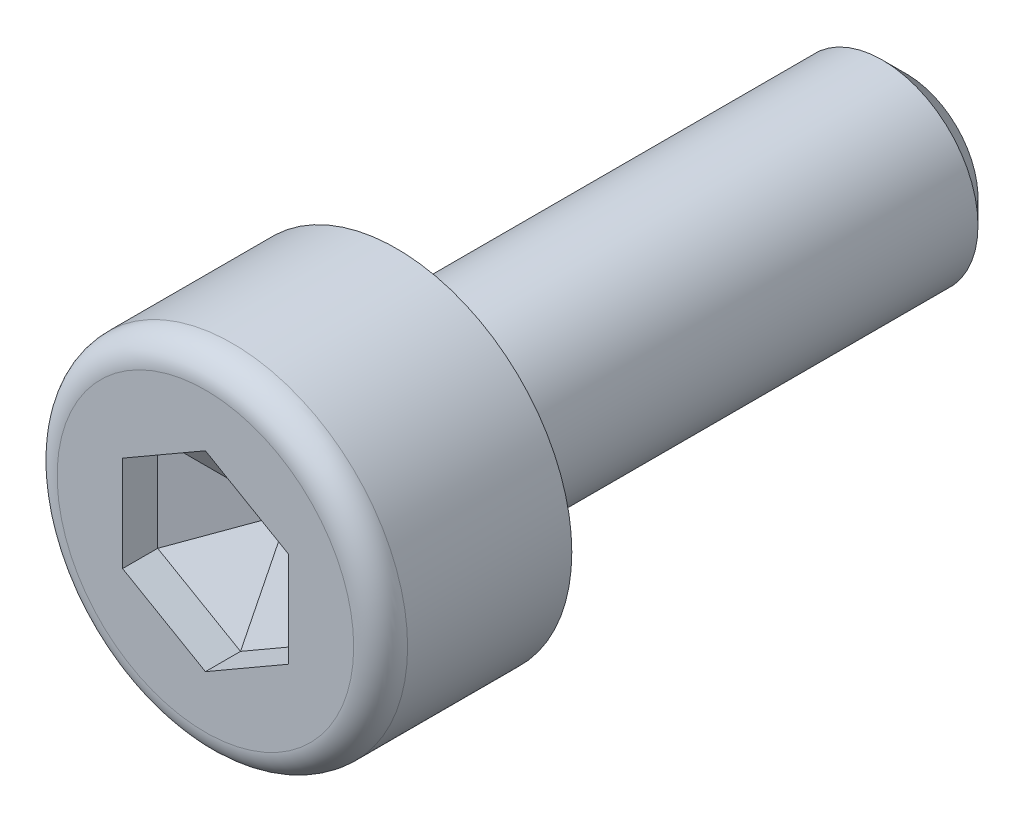
ISO-10303-21;
HEADER;
FILE_DESCRIPTION(('STEP AP214'),'2;1');
FILE_NAME('part.step','',(''),(''),'','','');
FILE_SCHEMA(('AUTOMOTIVE_DESIGN { 1 0 10303 214 1 1 1 1 }'));
ENDSEC;
DATA;
#1=APPLICATION_CONTEXT('core data for automotive mechanical design processes');
#2=APPLICATION_PROTOCOL_DEFINITION('international standard','automotive_design',2000,#1);
#3=PRODUCT_CONTEXT('',#1,'mechanical');
#4=PRODUCT('Part','Part','',(#3));
#5=PRODUCT_RELATED_PRODUCT_CATEGORY('part','',(#4));
#6=PRODUCT_DEFINITION_FORMATION('','',#4);
#7=PRODUCT_DEFINITION_CONTEXT('part definition',#1,'design');
#8=PRODUCT_DEFINITION('design','',#6,#7);
#9=PRODUCT_DEFINITION_SHAPE('','',#8);
#10=(LENGTH_UNIT() NAMED_UNIT(*) SI_UNIT(.MILLI.,.METRE.));
#11=(NAMED_UNIT(*) PLANE_ANGLE_UNIT() SI_UNIT($,.RADIAN.));
#12=(NAMED_UNIT(*) SI_UNIT($,.STERADIAN.) SOLID_ANGLE_UNIT());
#13=UNCERTAINTY_MEASURE_WITH_UNIT(LENGTH_MEASURE(1.E-05),#10,'distance_accuracy_value','');
#14=(GEOMETRIC_REPRESENTATION_CONTEXT(3) GLOBAL_UNCERTAINTY_ASSIGNED_CONTEXT((#13)) GLOBAL_UNIT_ASSIGNED_CONTEXT((#10,
#11,#12)) REPRESENTATION_CONTEXT('',''));
#15=CARTESIAN_POINT('',(0.,0.,0.));
#16=DIRECTION('',(0.,0.,1.));
#17=DIRECTION('',(1.,0.,0.));
#18=AXIS2_PLACEMENT_3D('',#15,#16,#17);
#19=CARTESIAN_POINT('',(0.,0.,0.));
#20=DIRECTION('',(0.,0.,1.));
#21=DIRECTION('',(1.,0.,0.));
#22=AXIS2_PLACEMENT_3D('',#19,#20,#21);
#23=PLANE('',#22);
#24=CARTESIAN_POINT('',(0.,0.,0.));
#25=DIRECTION('',(0.,0.,1.));
#26=DIRECTION('',(1.,0.,0.));
#27=AXIS2_PLACEMENT_3D('',#24,#25,#26);
#28=CIRCLE('',#27,1.6);
#29=CARTESIAN_POINT('',(1.6,0.,0.));
#30=VERTEX_POINT('',#29);
#31=EDGE_CURVE('E11',#30,#30,#28,.T.);
#32=ORIENTED_EDGE('',*,*,#31,.T.);
#33=EDGE_LOOP('',(#32));
#34=FACE_BOUND('',#33,.T.);
#35=CARTESIAN_POINT('',(0.,0.,0.));
#36=DIRECTION('',(0.,0.,1.));
#37=DIRECTION('',(1.,0.,0.));
#38=AXIS2_PLACEMENT_3D('',#35,#36,#37);
#39=CIRCLE('',#38,2.75);
#40=CARTESIAN_POINT('',(2.75,0.,0.));
#41=VERTEX_POINT('',#40);
#42=EDGE_CURVE('E154',#41,#41,#39,.T.);
#43=ORIENTED_EDGE('',*,*,#42,.F.);
#44=EDGE_LOOP('',(#43));
#45=FACE_BOUND('',#44,.T.);
#46=ADVANCED_FACE('F44',(#34,#45),#23,.F.);
#47=CARTESIAN_POINT('',(0.,0.,3.));
#48=DIRECTION('',(0.,0.,-1.));
#49=DIRECTION('',(-1.,0.,0.));
#50=AXIS2_PLACEMENT_3D('',#47,#48,#49);
#51=CYLINDRICAL_SURFACE('',#50,2.75);
#52=CARTESIAN_POINT('',(0.,0.,2.57692307692308));
#53=DIRECTION('',(0.,0.,1.));
#54=DIRECTION('',(1.,0.,0.));
#55=AXIS2_PLACEMENT_3D('',#52,#53,#54);
#56=CIRCLE('',#55,2.75);
#57=CARTESIAN_POINT('',(2.75,0.,2.57692307692308));
#58=VERTEX_POINT('',#57);
#59=EDGE_CURVE('E173',#58,#58,#56,.F.);
#60=ORIENTED_EDGE('',*,*,#59,.T.);
#61=EDGE_LOOP('',(#60));
#62=FACE_BOUND('',#61,.T.);
#63=ORIENTED_EDGE('',*,*,#42,.T.);
#64=EDGE_LOOP('',(#63));
#65=FACE_BOUND('',#64,.T.);
#66=ADVANCED_FACE('F235',(#62,#65),#51,.T.);
#67=CARTESIAN_POINT('',(0.,0.,3.));
#68=DIRECTION('',(0.,0.,1.));
#69=DIRECTION('',(1.,0.,0.));
#70=AXIS2_PLACEMENT_3D('',#67,#68,#69);
#71=PLANE('',#70);
#72=CARTESIAN_POINT('',(0.,0.,3.));
#73=DIRECTION('',(0.,0.,1.));
#74=DIRECTION('',(1.,0.,0.));
#75=AXIS2_PLACEMENT_3D('',#72,#73,#74);
#76=CIRCLE('',#75,2.32692307692308);
#77=CARTESIAN_POINT('',(2.32692307692308,0.,3.));
#78=VERTEX_POINT('',#77);
#79=EDGE_CURVE('E167',#78,#78,#76,.T.);
#80=ORIENTED_EDGE('',*,*,#79,.T.);
#81=EDGE_LOOP('',(#80));
#82=FACE_BOUND('',#81,.T.);
#83=DIRECTION('',(0.,1.,0.));
#84=VECTOR('',#83,1.);
#85=CARTESIAN_POINT('',(1.3,-0.750555349946514,3.));
#86=LINE('',#85,#84);
#87=CARTESIAN_POINT('',(1.3,-0.750555349946514,3.));
#88=VERTEX_POINT('',#87);
#89=CARTESIAN_POINT('',(1.3,0.750555349946514,3.));
#90=VERTEX_POINT('',#89);
#91=EDGE_CURVE('E136',#88,#90,#86,.T.);
#92=ORIENTED_EDGE('',*,*,#91,.F.);
#93=DIRECTION('',(0.866025403784439,0.5,0.));
#94=VECTOR('',#93,1.);
#95=CARTESIAN_POINT('',(0.,-1.50111069989303,3.));
#96=LINE('',#95,#94);
#97=CARTESIAN_POINT('',(0.,-1.50111069989303,3.));
#98=VERTEX_POINT('',#97);
#99=EDGE_CURVE('E149',#98,#88,#96,.T.);
#100=ORIENTED_EDGE('',*,*,#99,.F.);
#101=DIRECTION('',(0.866025403784439,-0.5,0.));
#102=VECTOR('',#101,1.);
#103=CARTESIAN_POINT('',(-1.3,-0.750555349946513,3.));
#104=LINE('',#103,#102);
#105=CARTESIAN_POINT('',(-1.3,-0.750555349946513,3.));
#106=VERTEX_POINT('',#105);
#107=EDGE_CURVE('E144',#106,#98,#104,.T.);
#108=ORIENTED_EDGE('',*,*,#107,.F.);
#109=DIRECTION('',(0.,-1.,0.));
#110=VECTOR('',#109,1.);
#111=CARTESIAN_POINT('',(-1.3,0.750555349946514,3.));
#112=LINE('',#111,#110);
#113=CARTESIAN_POINT('',(-1.3,0.750555349946514,3.));
#114=VERTEX_POINT('',#113);
#115=EDGE_CURVE('E145',#114,#106,#112,.T.);
#116=ORIENTED_EDGE('',*,*,#115,.F.);
#117=DIRECTION('',(-0.866025403784439,-0.5,0.));
#118=VECTOR('',#117,1.);
#119=CARTESIAN_POINT('',(0.,1.50111069989303,3.));
#120=LINE('',#119,#118);
#121=CARTESIAN_POINT('',(0.,1.50111069989303,3.));
#122=VERTEX_POINT('',#121);
#123=EDGE_CURVE('E125',#122,#114,#120,.T.);
#124=ORIENTED_EDGE('',*,*,#123,.F.);
#125=DIRECTION('',(-0.866025403784439,0.5,0.));
#126=VECTOR('',#125,1.);
#127=CARTESIAN_POINT('',(1.3,0.750555349946514,3.));
#128=LINE('',#127,#126);
#129=EDGE_CURVE('E135',#90,#122,#128,.T.);
#130=ORIENTED_EDGE('',*,*,#129,.F.);
#131=EDGE_LOOP('',(#92,#100,#108,#116,#124,#130));
#132=FACE_BOUND('',#131,.T.);
#133=ADVANCED_FACE('F138',(#82,#132),#71,.T.);
#134=CARTESIAN_POINT('',(1.3,-0.750555349946514,1.7));
#135=DIRECTION('',(1.,0.,0.));
#136=DIRECTION('',(0.,1.,0.));
#137=AXIS2_PLACEMENT_3D('',#134,#135,#136);
#138=PLANE('',#137);
#139=DIRECTION('',(0.,0.,1.));
#140=VECTOR('',#139,1.);
#141=CARTESIAN_POINT('',(1.3,0.750555349946514,1.7));
#142=LINE('',#141,#140);
#143=CARTESIAN_POINT('',(1.3,0.750555349946514,2.4492795389049));
#144=VERTEX_POINT('',#143);
#145=EDGE_CURVE('E127',#144,#90,#142,.T.);
#146=ORIENTED_EDGE('',*,*,#145,.F.);
#147=DIRECTION('',(0.,-1.,0.));
#148=VECTOR('',#147,1.);
#149=CARTESIAN_POINT('',(1.3,-0.750555349946514,2.4492795389049));
#150=LINE('',#149,#148);
#151=CARTESIAN_POINT('',(1.3,-0.750555349946514,2.4492795389049));
#152=VERTEX_POINT('',#151);
#153=EDGE_CURVE('E67',#144,#152,#150,.T.);
#154=ORIENTED_EDGE('',*,*,#153,.T.);
#155=DIRECTION('',(0.,0.,1.));
#156=VECTOR('',#155,1.);
#157=CARTESIAN_POINT('',(1.3,-0.750555349946514,1.7));
#158=LINE('',#157,#156);
#159=EDGE_CURVE('E152',#152,#88,#158,.T.);
#160=ORIENTED_EDGE('',*,*,#159,.T.);
#161=ORIENTED_EDGE('',*,*,#91,.T.);
#162=EDGE_LOOP('',(#146,#154,#160,#161));
#163=FACE_BOUND('',#162,.T.);
#164=ADVANCED_FACE('F292',(#163),#138,.F.);
#165=CARTESIAN_POINT('',(0.,-1.50111069989303,1.7));
#166=DIRECTION('',(0.5,-0.866025403784439,0.));
#167=DIRECTION('',(0.866025403784439,0.5,0.));
#168=AXIS2_PLACEMENT_3D('',#165,#166,#167);
#169=PLANE('',#168);
#170=ORIENTED_EDGE('',*,*,#159,.F.);
#171=DIRECTION('',(-0.866025403784439,-0.5,0.));
#172=VECTOR('',#171,1.);
#173=CARTESIAN_POINT('',(0.,-1.50111069989303,2.4492795389049));
#174=LINE('',#173,#172);
#175=CARTESIAN_POINT('',(0.,-1.50111069989303,2.4492795389049));
#176=VERTEX_POINT('',#175);
#177=EDGE_CURVE('E58',#152,#176,#174,.T.);
#178=ORIENTED_EDGE('',*,*,#177,.T.);
#179=DIRECTION('',(0.,0.,1.));
#180=VECTOR('',#179,1.);
#181=CARTESIAN_POINT('',(0.,-1.50111069989303,1.7));
#182=LINE('',#181,#180);
#183=EDGE_CURVE('E159',#176,#98,#182,.T.);
#184=ORIENTED_EDGE('',*,*,#183,.T.);
#185=ORIENTED_EDGE('',*,*,#99,.T.);
#186=EDGE_LOOP('',(#170,#178,#184,#185));
#187=FACE_BOUND('',#186,.T.);
#188=ADVANCED_FACE('F295',(#187),#169,.F.);
#189=CARTESIAN_POINT('',(-1.3,-0.750555349946513,1.7));
#190=DIRECTION('',(-0.5,-0.866025403784439,0.));
#191=DIRECTION('',(0.866025403784439,-0.5,0.));
#192=AXIS2_PLACEMENT_3D('',#189,#190,#191);
#193=PLANE('',#192);
#194=ORIENTED_EDGE('',*,*,#183,.F.);
#195=DIRECTION('',(-0.866025403784439,0.5,0.));
#196=VECTOR('',#195,1.);
#197=CARTESIAN_POINT('',(-1.3,-0.750555349946513,2.4492795389049));
#198=LINE('',#197,#196);
#199=CARTESIAN_POINT('',(-1.3,-0.750555349946513,2.4492795389049));
#200=VERTEX_POINT('',#199);
#201=EDGE_CURVE('E196',#176,#200,#198,.T.);
#202=ORIENTED_EDGE('',*,*,#201,.T.);
#203=DIRECTION('',(0.,0.,1.));
#204=VECTOR('',#203,1.);
#205=CARTESIAN_POINT('',(-1.3,-0.750555349946513,1.7));
#206=LINE('',#205,#204);
#207=EDGE_CURVE('E160',#200,#106,#206,.T.);
#208=ORIENTED_EDGE('',*,*,#207,.T.);
#209=ORIENTED_EDGE('',*,*,#107,.T.);
#210=EDGE_LOOP('',(#194,#202,#208,#209));
#211=FACE_BOUND('',#210,.T.);
#212=ADVANCED_FACE('F282',(#211),#193,.F.);
#213=CARTESIAN_POINT('',(-1.3,0.750555349946514,1.7));
#214=DIRECTION('',(-1.,0.,0.));
#215=DIRECTION('',(0.,0.,1.));
#216=AXIS2_PLACEMENT_3D('',#213,#214,#215);
#217=PLANE('',#216);
#218=ORIENTED_EDGE('',*,*,#207,.F.);
#219=DIRECTION('',(0.,1.,0.));
#220=VECTOR('',#219,1.);
#221=CARTESIAN_POINT('',(-1.3,0.750555349946514,2.4492795389049));
#222=LINE('',#221,#220);
#223=CARTESIAN_POINT('',(-1.3,0.750555349946514,2.4492795389049));
#224=VERTEX_POINT('',#223);
#225=EDGE_CURVE('E186',#200,#224,#222,.T.);
#226=ORIENTED_EDGE('',*,*,#225,.T.);
#227=DIRECTION('',(0.,0.,1.));
#228=VECTOR('',#227,1.);
#229=CARTESIAN_POINT('',(-1.3,0.750555349946514,1.7));
#230=LINE('',#229,#228);
#231=EDGE_CURVE('E126',#224,#114,#230,.T.);
#232=ORIENTED_EDGE('',*,*,#231,.T.);
#233=ORIENTED_EDGE('',*,*,#115,.T.);
#234=EDGE_LOOP('',(#218,#226,#232,#233));
#235=FACE_BOUND('',#234,.T.);
#236=ADVANCED_FACE('F289',(#235),#217,.F.);
#237=CARTESIAN_POINT('',(0.,1.50111069989303,1.7));
#238=DIRECTION('',(-0.5,0.866025403784439,0.));
#239=DIRECTION('',(-0.866025403784439,-0.5,0.));
#240=AXIS2_PLACEMENT_3D('',#237,#238,#239);
#241=PLANE('',#240);
#242=ORIENTED_EDGE('',*,*,#231,.F.);
#243=DIRECTION('',(0.866025403784439,0.5,0.));
#244=VECTOR('',#243,1.);
#245=CARTESIAN_POINT('',(0.,1.50111069989303,2.4492795389049));
#246=LINE('',#245,#244);
#247=CARTESIAN_POINT('',(0.,1.50111069989303,2.4492795389049));
#248=VERTEX_POINT('',#247);
#249=EDGE_CURVE('E123',#224,#248,#246,.T.);
#250=ORIENTED_EDGE('',*,*,#249,.T.);
#251=DIRECTION('',(0.,0.,1.));
#252=VECTOR('',#251,1.);
#253=CARTESIAN_POINT('',(0.,1.50111069989303,1.7));
#254=LINE('',#253,#252);
#255=EDGE_CURVE('E120',#248,#122,#254,.T.);
#256=ORIENTED_EDGE('',*,*,#255,.T.);
#257=ORIENTED_EDGE('',*,*,#123,.T.);
#258=EDGE_LOOP('',(#242,#250,#256,#257));
#259=FACE_BOUND('',#258,.T.);
#260=ADVANCED_FACE('F119',(#259),#241,.F.);
#261=CARTESIAN_POINT('',(1.3,0.750555349946514,1.7));
#262=DIRECTION('',(0.5,0.866025403784439,0.));
#263=DIRECTION('',(-0.866025403784439,0.5,0.));
#264=AXIS2_PLACEMENT_3D('',#261,#262,#263);
#265=PLANE('',#264);
#266=ORIENTED_EDGE('',*,*,#255,.F.);
#267=DIRECTION('',(0.866025403784439,-0.5,0.));
#268=VECTOR('',#267,1.);
#269=CARTESIAN_POINT('',(1.3,0.750555349946514,2.4492795389049));
#270=LINE('',#269,#268);
#271=EDGE_CURVE('E191',#248,#144,#270,.T.);
#272=ORIENTED_EDGE('',*,*,#271,.T.);
#273=ORIENTED_EDGE('',*,*,#145,.T.);
#274=ORIENTED_EDGE('',*,*,#129,.T.);
#275=EDGE_LOOP('',(#266,#272,#273,#274));
#276=FACE_BOUND('',#275,.T.);
#277=ADVANCED_FACE('F132',(#276),#265,.F.);
#278=CARTESIAN_POINT('',(0.,0.,1.7));
#279=DIRECTION('',(0.,0.,1.));
#280=DIRECTION('',(1.,0.,0.));
#281=AXIS2_PLACEMENT_3D('',#278,#279,#280);
#282=PLANE('',#281);
#283=DIRECTION('',(-0.866025403784439,-0.5,0.));
#284=VECTOR('',#283,1.);
#285=CARTESIAN_POINT('',(-0.00110488477245908,0.00191371656240831,1.7));
#286=LINE('',#285,#284);
#287=CARTESIAN_POINT('',(0.,0.00255162208321077,1.7));
#288=VERTEX_POINT('',#287);
#289=CARTESIAN_POINT('',(-0.00220976954491822,0.00127581104160551,1.7));
#290=VERTEX_POINT('',#289);
#291=EDGE_CURVE('E183',#288,#290,#286,.T.);
#292=ORIENTED_EDGE('',*,*,#291,.T.);
#293=DIRECTION('',(0.,-1.,0.));
#294=VECTOR('',#293,1.);
#295=CARTESIAN_POINT('',(-0.00220976954491822,0.,1.7));
#296=LINE('',#295,#294);
#297=CARTESIAN_POINT('',(-0.00220976954491822,-0.00127581104160539,1.7));
#298=VERTEX_POINT('',#297);
#299=EDGE_CURVE('E187',#290,#298,#296,.T.);
#300=ORIENTED_EDGE('',*,*,#299,.T.);
#301=DIRECTION('',(0.866025403784439,-0.5,0.));
#302=VECTOR('',#301,1.);
#303=CARTESIAN_POINT('',(-0.00110488477245903,-0.00191371656240821,1.7));
#304=LINE('',#303,#302);
#305=CARTESIAN_POINT('',(0.,-0.00255162208321082,1.7));
#306=VERTEX_POINT('',#305);
#307=EDGE_CURVE('E178',#298,#306,#304,.T.);
#308=ORIENTED_EDGE('',*,*,#307,.T.);
#309=DIRECTION('',(0.866025403784439,0.5,0.));
#310=VECTOR('',#309,1.);
#311=CARTESIAN_POINT('',(0.00110488477245889,-0.00191371656240798,1.7));
#312=LINE('',#311,#310);
#313=CARTESIAN_POINT('',(0.00220976954491811,-0.0012758110416051,1.7));
#314=VERTEX_POINT('',#313);
#315=EDGE_CURVE('E176',#306,#314,#312,.T.);
#316=ORIENTED_EDGE('',*,*,#315,.T.);
#317=DIRECTION('',(0.,1.,0.));
#318=VECTOR('',#317,1.);
#319=CARTESIAN_POINT('',(0.00220976954491811,0.,1.7));
#320=LINE('',#319,#318);
#321=CARTESIAN_POINT('',(0.00220976954491811,0.00127581104160497,1.7));
#322=VERTEX_POINT('',#321);
#323=EDGE_CURVE('E179',#314,#322,#320,.T.);
#324=ORIENTED_EDGE('',*,*,#323,.T.);
#325=DIRECTION('',(-0.866025403784439,0.5,0.));
#326=VECTOR('',#325,1.);
#327=CARTESIAN_POINT('',(0.00110488477245884,0.00191371656240789,1.7));
#328=LINE('',#327,#326);
#329=EDGE_CURVE('E185',#322,#288,#328,.T.);
#330=ORIENTED_EDGE('',*,*,#329,.T.);
#331=EDGE_LOOP('',(#292,#300,#308,#316,#324,#330));
#332=FACE_BOUND('',#331,.T.);
#333=ADVANCED_FACE('F303',(#332),#282,.T.);
#334=CARTESIAN_POINT('',(0.,0.,-8.));
#335=DIRECTION('',(0.,0.,1.));
#336=DIRECTION('',(1.,0.,0.));
#337=AXIS2_PLACEMENT_3D('',#334,#335,#336);
#338=CYLINDRICAL_SURFACE('',#337,1.5);
#339=CARTESIAN_POINT('',(0.,0.,-0.0999999999999994));
#340=DIRECTION('',(0.,0.,1.));
#341=DIRECTION('',(1.,0.,0.));
#342=AXIS2_PLACEMENT_3D('',#339,#340,#341);
#343=CIRCLE('',#342,1.5);
#344=CARTESIAN_POINT('',(1.5,0.,-0.0999999999999994));
#345=VERTEX_POINT('',#344);
#346=EDGE_CURVE('E52',#345,#345,#343,.F.);
#347=ORIENTED_EDGE('',*,*,#346,.T.);
#348=EDGE_LOOP('',(#347));
#349=FACE_BOUND('',#348,.T.);
#350=CARTESIAN_POINT('',(0.,0.,-7.625));
#351=DIRECTION('',(0.,0.,-1.));
#352=DIRECTION('',(-1.,0.,0.));
#353=AXIS2_PLACEMENT_3D('',#350,#351,#352);
#354=CIRCLE('',#353,1.5);
#355=CARTESIAN_POINT('',(-1.5,0.,-7.625));
#356=VERTEX_POINT('',#355);
#357=EDGE_CURVE('E170',#356,#356,#354,.F.);
#358=ORIENTED_EDGE('',*,*,#357,.T.);
#359=EDGE_LOOP('',(#358));
#360=FACE_BOUND('',#359,.T.);
#361=ADVANCED_FACE('F220',(#349,#360),#338,.T.);
#362=CARTESIAN_POINT('',(0.,0.,-8.));
#363=DIRECTION('',(0.,0.,-1.));
#364=DIRECTION('',(-1.,0.,0.));
#365=AXIS2_PLACEMENT_3D('',#362,#363,#364);
#366=PLANE('',#365);
#367=CARTESIAN_POINT('',(0.,0.,-8.));
#368=DIRECTION('',(0.,0.,-1.));
#369=DIRECTION('',(-1.,0.,0.));
#370=AXIS2_PLACEMENT_3D('',#367,#368,#369);
#371=CIRCLE('',#370,1.125);
#372=CARTESIAN_POINT('',(-1.125,0.,-8.));
#373=VERTEX_POINT('',#372);
#374=EDGE_CURVE('E165',#373,#373,#371,.T.);
#375=ORIENTED_EDGE('',*,*,#374,.T.);
#376=EDGE_LOOP('',(#375));
#377=FACE_BOUND('',#376,.T.);
#378=ADVANCED_FACE('F247',(#377),#366,.T.);
#379=CARTESIAN_POINT('',(0.,0.,-8.));
#380=DIRECTION('',(0.,0.,1.));
#381=DIRECTION('',(1.,0.,0.));
#382=AXIS2_PLACEMENT_3D('',#379,#380,#381);
#383=CONICAL_SURFACE('',#382,1.125,0.785398163397446);
#384=ORIENTED_EDGE('',*,*,#357,.F.);
#385=EDGE_LOOP('',(#384));
#386=FACE_BOUND('',#385,.T.);
#387=ORIENTED_EDGE('',*,*,#374,.F.);
#388=EDGE_LOOP('',(#387));
#389=FACE_BOUND('',#388,.T.);
#390=ADVANCED_FACE('F242',(#386,#389),#383,.T.);
#391=CARTESIAN_POINT('',(0.,0.,2.57692307692308));
#392=DIRECTION('',(0.,0.,1.));
#393=DIRECTION('',(1.,0.,0.));
#394=AXIS2_PLACEMENT_3D('',#391,#392,#393);
#395=TOROIDAL_SURFACE('',#394,2.32692307692308,0.423076923076923);
#396=ORIENTED_EDGE('',*,*,#59,.F.);
#397=EDGE_LOOP('',(#396));
#398=FACE_BOUND('',#397,.T.);
#399=ORIENTED_EDGE('',*,*,#79,.F.);
#400=EDGE_LOOP('',(#399));
#401=FACE_BOUND('',#400,.T.);
#402=ADVANCED_FACE('F250',(#398,#401),#395,.T.);
#403=CARTESIAN_POINT('',(0.00220976954491811,0.,1.7));
#404=DIRECTION('',(0.499999999999995,0.,-0.866025403784441));
#405=DIRECTION('',(0.,1.,0.));
#406=AXIS2_PLACEMENT_3D('',#403,#404,#405);
#407=PLANE('',#406);
#408=DIRECTION('',(-0.774596669241485,0.447213595499959,-0.447213595499953));
#409=VECTOR('',#408,1.);
#410=CARTESIAN_POINT('',(0.00176781563593457,-0.0010206488332842,1.69974483779168));
#411=LINE('',#410,#409);
#412=EDGE_CURVE('E209',#152,#314,#411,.T.);
#413=ORIENTED_EDGE('',*,*,#412,.F.);
#414=ORIENTED_EDGE('',*,*,#153,.F.);
#415=DIRECTION('',(-0.774596669241485,-0.447213595499959,-0.447213595499953));
#416=VECTOR('',#415,1.);
#417=CARTESIAN_POINT('',(0.0017678156359344,0.00102064883328385,1.69974483779168));
#418=LINE('',#417,#416);
#419=EDGE_CURVE('E215',#322,#144,#418,.F.);
#420=ORIENTED_EDGE('',*,*,#419,.F.);
#421=ORIENTED_EDGE('',*,*,#323,.F.);
#422=EDGE_LOOP('',(#413,#414,#420,#421));
#423=FACE_BOUND('',#422,.T.);
#424=ADVANCED_FACE('F252',(#423),#407,.F.);
#425=CARTESIAN_POINT('',(0.00110488477245884,0.00191371656240789,1.7));
#426=DIRECTION('',(0.249999999999997,0.433012701892215,-0.866025403784441));
#427=DIRECTION('',(-0.866025403784439,0.5,0.));
#428=AXIS2_PLACEMENT_3D('',#425,#426,#427);
#429=PLANE('',#428);
#430=ORIENTED_EDGE('',*,*,#419,.T.);
#431=ORIENTED_EDGE('',*,*,#271,.F.);
#432=DIRECTION('',(0.,-0.894427190999918,-0.447213595499953));
#433=VECTOR('',#432,1.);
#434=CARTESIAN_POINT('',(0.,0.0020412976665688,1.69974483779168));
#435=LINE('',#434,#433);
#436=EDGE_CURVE('E207',#288,#248,#435,.F.);
#437=ORIENTED_EDGE('',*,*,#436,.F.);
#438=ORIENTED_EDGE('',*,*,#329,.F.);
#439=EDGE_LOOP('',(#430,#431,#437,#438));
#440=FACE_BOUND('',#439,.T.);
#441=ADVANCED_FACE('F263',(#440),#429,.F.);
#442=CARTESIAN_POINT('',(0.00110488477245895,-0.00191371656240807,1.7));
#443=DIRECTION('',(0.249999999999997,-0.433012701892215,-0.866025403784441));
#444=DIRECTION('',(0.866025403784439,0.5,0.));
#445=AXIS2_PLACEMENT_3D('',#442,#443,#444);
#446=PLANE('',#445);
#447=ORIENTED_EDGE('',*,*,#412,.T.);
#448=ORIENTED_EDGE('',*,*,#315,.F.);
#449=DIRECTION('',(0.,-0.894427190999918,0.447213595499953));
#450=VECTOR('',#449,1.);
#451=CARTESIAN_POINT('',(0.,-0.00204129766656878,1.69974483779168));
#452=LINE('',#451,#450);
#453=EDGE_CURVE('E205',#176,#306,#452,.F.);
#454=ORIENTED_EDGE('',*,*,#453,.F.);
#455=ORIENTED_EDGE('',*,*,#177,.F.);
#456=EDGE_LOOP('',(#447,#448,#454,#455));
#457=FACE_BOUND('',#456,.T.);
#458=ADVANCED_FACE('F259',(#457),#446,.F.);
#459=CARTESIAN_POINT('',(-0.00110488477245908,0.00191371656240831,1.7));
#460=DIRECTION('',(-0.249999999999997,0.433012701892215,-0.866025403784441));
#461=DIRECTION('',(-0.866025403784439,-0.5,0.));
#462=AXIS2_PLACEMENT_3D('',#459,#460,#461);
#463=PLANE('',#462);
#464=ORIENTED_EDGE('',*,*,#436,.T.);
#465=ORIENTED_EDGE('',*,*,#249,.F.);
#466=DIRECTION('',(0.774596669241485,-0.447213595499959,-0.447213595499953));
#467=VECTOR('',#466,1.);
#468=CARTESIAN_POINT('',(-0.00176781563593459,0.00102064883328441,1.69974483779168));
#469=LINE('',#468,#467);
#470=EDGE_CURVE('E204',#290,#224,#469,.F.);
#471=ORIENTED_EDGE('',*,*,#470,.F.);
#472=ORIENTED_EDGE('',*,*,#291,.F.);
#473=EDGE_LOOP('',(#464,#465,#471,#472));
#474=FACE_BOUND('',#473,.T.);
#475=ADVANCED_FACE('F258',(#474),#463,.F.);
#476=CARTESIAN_POINT('',(-0.00110488477245906,-0.00191371656240826,1.7));
#477=DIRECTION('',(-0.249999999999998,-0.433012701892215,-0.866025403784441));
#478=DIRECTION('',(0.866025403784439,-0.5,0.));
#479=AXIS2_PLACEMENT_3D('',#476,#477,#478);
#480=PLANE('',#479);
#481=ORIENTED_EDGE('',*,*,#453,.T.);
#482=ORIENTED_EDGE('',*,*,#307,.F.);
#483=DIRECTION('',(-0.774596669241485,-0.447213595499959,0.447213595499953));
#484=VECTOR('',#483,1.);
#485=CARTESIAN_POINT('',(-0.00176781563593462,-0.00102064883328435,1.69974483779168));
#486=LINE('',#485,#484);
#487=EDGE_CURVE('E198',#200,#298,#486,.F.);
#488=ORIENTED_EDGE('',*,*,#487,.F.);
#489=ORIENTED_EDGE('',*,*,#201,.F.);
#490=EDGE_LOOP('',(#481,#482,#488,#489));
#491=FACE_BOUND('',#490,.T.);
#492=ADVANCED_FACE('F227',(#491),#480,.F.);
#493=CARTESIAN_POINT('',(-0.00220976954491822,0.,1.7));
#494=DIRECTION('',(-0.499999999999995,0.,-0.866025403784441));
#495=DIRECTION('',(0.,-1.,0.));
#496=AXIS2_PLACEMENT_3D('',#493,#494,#495);
#497=PLANE('',#496);
#498=ORIENTED_EDGE('',*,*,#470,.T.);
#499=ORIENTED_EDGE('',*,*,#225,.F.);
#500=ORIENTED_EDGE('',*,*,#487,.T.);
#501=ORIENTED_EDGE('',*,*,#299,.F.);
#502=EDGE_LOOP('',(#498,#499,#500,#501));
#503=FACE_BOUND('',#502,.T.);
#504=ADVANCED_FACE('F224',(#503),#497,.F.);
#505=CARTESIAN_POINT('',(0.,0.,-0.0999999999999994));
#506=DIRECTION('',(0.,0.,1.));
#507=DIRECTION('',(1.,0.,0.));
#508=AXIS2_PLACEMENT_3D('',#505,#506,#507);
#509=TOROIDAL_SURFACE('',#508,1.6,0.1);
#510=ORIENTED_EDGE('',*,*,#31,.F.);
#511=EDGE_LOOP('',(#510));
#512=FACE_BOUND('',#511,.T.);
#513=ORIENTED_EDGE('',*,*,#346,.F.);
#514=EDGE_LOOP('',(#513));
#515=FACE_BOUND('',#514,.T.);
#516=ADVANCED_FACE('F50',(#512,#515),#509,.F.);
#517=CLOSED_SHELL('',(#46,#66,#133,#164,#188,#212,#236,#260,#277,#333,#361,#378,#390,#402,#424,
#441,#458,#475,#492,#504,#516));
#518=MANIFOLD_SOLID_BREP('B2',#517);
#519=ADVANCED_BREP_SHAPE_REPRESENTATION('',(#18,#518),#14);
#520=SHAPE_DEFINITION_REPRESENTATION(#9,#519);
ENDSEC;
END-ISO-10303-21;
